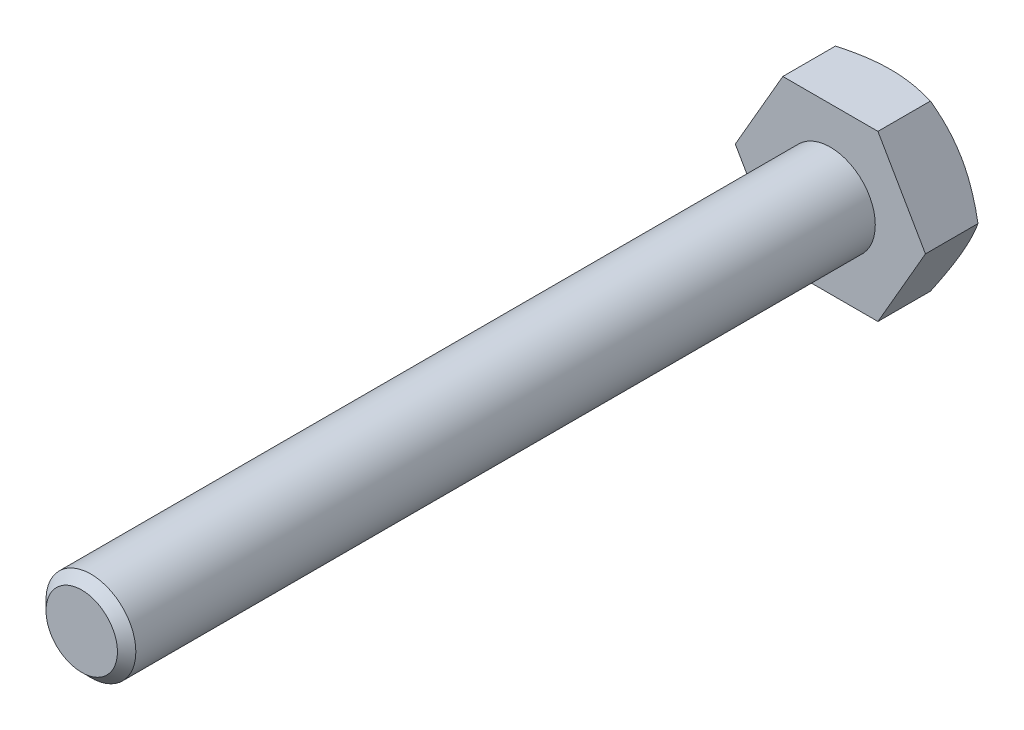
ISO-10303-21;
HEADER;
FILE_DESCRIPTION(('STEP AP214'),'2;1');
FILE_NAME('part.step','',(''),(''),'','','');
FILE_SCHEMA(('AUTOMOTIVE_DESIGN { 1 0 10303 214 1 1 1 1 }'));
ENDSEC;
DATA;
#1=APPLICATION_CONTEXT('core data for automotive mechanical design processes');
#2=APPLICATION_PROTOCOL_DEFINITION('international standard','automotive_design',2000,#1);
#3=PRODUCT_CONTEXT('',#1,'mechanical');
#4=PRODUCT('Part','Part','',(#3));
#5=PRODUCT_RELATED_PRODUCT_CATEGORY('part','',(#4));
#6=PRODUCT_DEFINITION_FORMATION('','',#4);
#7=PRODUCT_DEFINITION_CONTEXT('part definition',#1,'design');
#8=PRODUCT_DEFINITION('design','',#6,#7);
#9=PRODUCT_DEFINITION_SHAPE('','',#8);
#10=(LENGTH_UNIT() NAMED_UNIT(*) SI_UNIT(.MILLI.,.METRE.));
#11=(NAMED_UNIT(*) PLANE_ANGLE_UNIT() SI_UNIT($,.RADIAN.));
#12=(NAMED_UNIT(*) SI_UNIT($,.STERADIAN.) SOLID_ANGLE_UNIT());
#13=UNCERTAINTY_MEASURE_WITH_UNIT(LENGTH_MEASURE(1.E-05),#10,'distance_accuracy_value','');
#14=(GEOMETRIC_REPRESENTATION_CONTEXT(3) GLOBAL_UNCERTAINTY_ASSIGNED_CONTEXT((#13)) GLOBAL_UNIT_ASSIGNED_CONTEXT((#10,
#11,#12)) REPRESENTATION_CONTEXT('',''));
#15=CARTESIAN_POINT('',(0.,0.,0.));
#16=DIRECTION('',(0.,0.,1.));
#17=DIRECTION('',(1.,0.,0.));
#18=AXIS2_PLACEMENT_3D('',#15,#16,#17);
#19=CARTESIAN_POINT('',(1.58771324027147,-2.75,2.));
#20=DIRECTION('',(-0.866025403784439,0.5,0.));
#21=DIRECTION('',(-0.5,-0.866025403784439,0.));
#22=AXIS2_PLACEMENT_3D('',#19,#20,#21);
#23=PLANE('',#22);
#24=CARTESIAN_POINT('',(3.17554195059678,0.000200000000001707,0.245686763364756));
#25=CARTESIAN_POINT('',(3.10576962051743,-0.120649220659903,0.205387662249254));
#26=CARTESIAN_POINT('',(3.03539502097908,-0.24254160262263,0.168736902597655));
#27=CARTESIAN_POINT('',(2.89342717394439,-0.488437126727888,0.104762182969802));
#28=CARTESIAN_POINT('',(2.82183140359859,-0.612444638573851,0.0774608556745041));
#29=CARTESIAN_POINT('',(2.67952717191843,-0.858922797975938,0.0349617452941237));
#30=CARTESIAN_POINT('',(2.60884060771578,-0.981355518587411,0.0194811186224597));
#31=CARTESIAN_POINT('',(2.46713482015519,-1.22679714236891,0.000999397369939557));
#32=CARTESIAN_POINT('',(2.39611611197038,-1.3498051532329,-0.00201700053739912));
#33=CARTESIAN_POINT('',(2.26341005486545,-1.57965878661078,0.00425314542854933));
#34=CARTESIAN_POINT('',(2.20170285541369,-1.68653879125401,0.0120001542767048));
#35=CARTESIAN_POINT('',(2.07869048467395,-1.89960246733474,0.0365551810643593));
#36=CARTESIAN_POINT('',(2.01738573896434,-2.00578540164888,0.053371589650577));
#37=CARTESIAN_POINT('',(1.89411967378235,-2.21928848939318,0.0954119223459613));
#38=CARTESIAN_POINT('',(1.83217395817123,-2.32658161614285,0.120814080687232));
#39=CARTESIAN_POINT('',(1.70920651275308,-2.53956747928405,0.178467225839978));
#40=CARTESIAN_POINT('',(1.64818320715446,-2.64526294502665,0.210704663298978));
#41=CARTESIAN_POINT('',(1.58759777021763,-2.7502,0.245686763364763));
#42=B_SPLINE_CURVE_WITH_KNOTS('',3,(#24,#25,#26,#27,#28,#29,#30,#31,#32,#33,#34,#35,#36,#37,#38,
#39,#40,#41),.UNSPECIFIED.,.F.,.F.,(4,2,2,2,2,2,2,2,4),(0.,0.435912828725885,0.872873557116326,
1.29901931904671,1.72464171213572,2.09526089052937,2.46622354066374,2.84541551798557,
3.22386274754524),.UNSPECIFIED.);
#43=CARTESIAN_POINT('',(3.17542648054293,0.,0.245620093061856));
#44=VERTEX_POINT('',#43);
#45=CARTESIAN_POINT('',(2.38156986040721,-1.375,0.));
#46=VERTEX_POINT('',#45);
#47=EDGE_CURVE('E124',#44,#46,#42,.T.);
#48=ORIENTED_EDGE('',*,*,#47,.F.);
#49=DIRECTION('',(0.,0.,-1.));
#50=VECTOR('',#49,1.);
#51=CARTESIAN_POINT('',(3.17542648054294,0.,2.));
#52=LINE('',#51,#50);
#53=CARTESIAN_POINT('',(3.17542648054294,0.,2.));
#54=VERTEX_POINT('',#53);
#55=EDGE_CURVE('E128',#54,#44,#52,.T.);
#56=ORIENTED_EDGE('',*,*,#55,.F.);
#57=DIRECTION('',(0.5,0.866025403784438,0.));
#58=VECTOR('',#57,1.);
#59=CARTESIAN_POINT('',(1.58771324027147,-2.75,2.));
#60=LINE('',#59,#58);
#61=CARTESIAN_POINT('',(1.58771324027147,-2.75,2.));
#62=VERTEX_POINT('',#61);
#63=EDGE_CURVE('E242',#62,#54,#60,.T.);
#64=ORIENTED_EDGE('',*,*,#63,.F.);
#65=DIRECTION('',(0.,0.,-1.));
#66=VECTOR('',#65,1.);
#67=CARTESIAN_POINT('',(1.58771324027147,-2.75,2.));
#68=LINE('',#67,#66);
#69=CARTESIAN_POINT('',(1.58771324027145,-2.75,0.245620093061854));
#70=VERTEX_POINT('',#69);
#71=EDGE_CURVE('E218',#62,#70,#68,.T.);
#72=ORIENTED_EDGE('',*,*,#71,.T.);
#73=EDGE_CURVE('E181',#46,#70,#42,.T.);
#74=ORIENTED_EDGE('',*,*,#73,.F.);
#75=EDGE_LOOP('',(#48,#56,#64,#72,#74));
#76=FACE_BOUND('',#75,.T.);
#77=ADVANCED_FACE('F32',(#76),#23,.F.);
#78=CARTESIAN_POINT('',(3.17542648054294,0.,2.));
#79=DIRECTION('',(-0.866025403784438,-0.5,0.));
#80=DIRECTION('',(0.5,-0.866025403784438,0.));
#81=AXIS2_PLACEMENT_3D('',#78,#79,#80);
#82=PLANE('',#81);
#83=CARTESIAN_POINT('',(1.58759777021763,2.7502,0.245686763364752));
#84=CARTESIAN_POINT('',(1.65737010029698,2.6293507793401,0.205387662249252));
#85=CARTESIAN_POINT('',(1.72774469983533,2.50745839737737,0.168736902597655));
#86=CARTESIAN_POINT('',(1.86971254687002,2.26156287327211,0.104762182969804));
#87=CARTESIAN_POINT('',(1.94130831721583,2.13755536142615,0.0774608556745066));
#88=CARTESIAN_POINT('',(2.08361254889599,1.89107720202406,0.0349617452941277));
#89=CARTESIAN_POINT('',(2.15429911309864,1.76864448141259,0.0194811186224644));
#90=CARTESIAN_POINT('',(2.29600490065922,1.52320285763109,0.000999397369945049));
#91=CARTESIAN_POINT('',(2.36702360884403,1.40019484676709,-0.00201700053739336));
#92=CARTESIAN_POINT('',(2.49972966594897,1.17034121338921,0.00425314542855519));
#93=CARTESIAN_POINT('',(2.56143686540072,1.06346120874598,0.0120001542767105));
#94=CARTESIAN_POINT('',(2.68444923614046,0.850397532665255,0.0365551810643646));
#95=CARTESIAN_POINT('',(2.74575398185008,0.744214598351115,0.0533715896505821));
#96=CARTESIAN_POINT('',(2.86902004703206,0.530711510606819,0.0954119223459655));
#97=CARTESIAN_POINT('',(2.93096576264318,0.423418383857147,0.120814080687235));
#98=CARTESIAN_POINT('',(3.05393320806134,0.210432520715949,0.17846722583998));
#99=CARTESIAN_POINT('',(3.11495651365995,0.104737054973347,0.210704663298979));
#100=CARTESIAN_POINT('',(3.17554195059678,-0.000199999999999859,0.245686763364762));
#101=B_SPLINE_CURVE_WITH_KNOTS('',3,(#83,#84,#85,#86,#87,#88,#89,#90,#91,#92,#93,#94,#95,#96,
#97,#98,#99,#100),.UNSPECIFIED.,.F.,.F.,(4,2,2,2,2,2,2,2,4),(0.,0.435912828725885,
0.872873557116326,1.29901931904671,1.72464171213573,2.09526089052937,2.46622354066374,
2.84541551798557,3.22386274754524),.UNSPECIFIED.);
#102=CARTESIAN_POINT('',(1.58771324027148,2.74999999999998,0.245620093061853));
#103=VERTEX_POINT('',#102);
#104=CARTESIAN_POINT('',(2.38156986040721,1.375,0.));
#105=VERTEX_POINT('',#104);
#106=EDGE_CURVE('E103',#103,#105,#101,.T.);
#107=ORIENTED_EDGE('',*,*,#106,.F.);
#108=DIRECTION('',(0.,0.,-1.));
#109=VECTOR('',#108,1.);
#110=CARTESIAN_POINT('',(1.58771324027147,2.75,2.));
#111=LINE('',#110,#109);
#112=CARTESIAN_POINT('',(1.58771324027147,2.75,2.));
#113=VERTEX_POINT('',#112);
#114=EDGE_CURVE('E227',#113,#103,#111,.T.);
#115=ORIENTED_EDGE('',*,*,#114,.F.);
#116=DIRECTION('',(-0.5,0.866025403784438,0.));
#117=VECTOR('',#116,1.);
#118=CARTESIAN_POINT('',(3.17542648054294,0.,2.));
#119=LINE('',#118,#117);
#120=EDGE_CURVE('E246',#54,#113,#119,.T.);
#121=ORIENTED_EDGE('',*,*,#120,.F.);
#122=ORIENTED_EDGE('',*,*,#55,.T.);
#123=EDGE_CURVE('E116',#105,#44,#101,.T.);
#124=ORIENTED_EDGE('',*,*,#123,.F.);
#125=EDGE_LOOP('',(#107,#115,#121,#122,#124));
#126=FACE_BOUND('',#125,.T.);
#127=ADVANCED_FACE('F136',(#126),#82,.F.);
#128=CARTESIAN_POINT('',(1.58771324027147,2.75,2.));
#129=DIRECTION('',(0.,-1.,0.));
#130=DIRECTION('',(0.,0.,-1.));
#131=AXIS2_PLACEMENT_3D('',#128,#129,#130);
#132=PLANE('',#131);
#133=CARTESIAN_POINT('',(-4.31638594918232,2.75,1.36715210704405));
#134=CARTESIAN_POINT('',(-4.19581737051592,2.75,1.30845994096474));
#135=CARTESIAN_POINT('',(-4.07497746694739,2.75,1.25031586425216));
#136=CARTESIAN_POINT('',(-3.83261088383623,2.75,1.13543119741228));
#137=CARTESIAN_POINT('',(-3.71108410410335,2.75,1.07869081888196));
#138=CARTESIAN_POINT('',(-3.46659808789897,2.75,0.966646426591317));
#139=CARTESIAN_POINT('',(-3.34363468385964,2.75,0.911351476138761));
#140=CARTESIAN_POINT('',(-3.09674757673776,2.75,0.802956993957643));
#141=CARTESIAN_POINT('',(-2.972823917902,2.75,0.749857361778766));
#142=CARTESIAN_POINT('',(-2.71965806564943,2.75,0.644703117588246));
#143=CARTESIAN_POINT('',(-2.59037652858395,2.75,0.592742724367116));
#144=CARTESIAN_POINT('',(-2.33032018429188,2.75,0.492631038352346));
#145=CARTESIAN_POINT('',(-2.19954521421087,2.75,0.444480165603219));
#146=CARTESIAN_POINT('',(-1.9365223444922,2.75,0.353213656190183));
#147=CARTESIAN_POINT('',(-1.80427786301001,2.75,0.310088265151207));
#148=CARTESIAN_POINT('',(-1.53789259482414,2.75,0.230222209632179));
#149=CARTESIAN_POINT('',(-1.40375240288282,2.75,0.193479588678769));
#150=CARTESIAN_POINT('',(-1.13423793476322,2.75,0.128302067791659));
#151=CARTESIAN_POINT('',(-0.998874970875652,2.75,0.0998212369444805));
#152=CARTESIAN_POINT('',(-0.726413092453885,2.75,0.0527456161691723));
#153=CARTESIAN_POINT('',(-0.589314364619276,2.75,0.0341497721022308));
#154=CARTESIAN_POINT('',(-0.315877662564309,2.75,0.00856858652498791));
#155=CARTESIAN_POINT('',(-0.179554395289457,2.75,0.0014299267905237));
#156=CARTESIAN_POINT('',(0.0932131339370565,2.75,-0.00103867463557896));
#157=CARTESIAN_POINT('',(0.229657397936016,2.75,0.00363158744684535));
#158=CARTESIAN_POINT('',(0.459764674388275,2.75,0.0211304631968855));
#159=CARTESIAN_POINT('',(0.553667213671686,2.75,0.0310050171194729));
#160=CARTESIAN_POINT('',(0.740814471055632,2.75,0.055760139531657));
#161=CARTESIAN_POINT('',(0.834059104056982,2.75,0.0706413439292701));
#162=CARTESIAN_POINT('',(1.11266283109748,2.75,0.122015798898182));
#163=CARTESIAN_POINT('',(1.29679769159134,2.75,0.165231761163537));
#164=CARTESIAN_POINT('',(1.57226006867404,2.75,0.240559912331172));
#165=CARTESIAN_POINT('',(1.66500394654352,2.75,0.267790894506829));
#166=CARTESIAN_POINT('',(1.84959145582332,2.75,0.325176661417261));
#167=CARTESIAN_POINT('',(1.9414350804195,2.75,0.355331468264057));
#168=CARTESIAN_POINT('',(2.12425036464145,2.75,0.418073021824297));
#169=CARTESIAN_POINT('',(2.21522226940173,2.75,0.450659060772911));
#170=CARTESIAN_POINT('',(2.3964050130485,2.75,0.517870145035879));
#171=CARTESIAN_POINT('',(2.48661586829762,2.75,0.552495146383974));
#172=CARTESIAN_POINT('',(2.72631941369534,2.75,0.647111868128739));
#173=CARTESIAN_POINT('',(2.87521406734214,2.75,0.708617133437105));
#174=CARTESIAN_POINT('',(3.17149877963133,2.75,0.835163108096415));
#175=CARTESIAN_POINT('',(3.31888867900127,2.75,0.900204187184521));
#176=CARTESIAN_POINT('',(3.612498606976,2.75,1.0329937298421));
#177=CARTESIAN_POINT('',(3.7587182324204,2.75,1.10074308197789));
#178=CARTESIAN_POINT('',(4.05017738563283,2.75,1.23832197569377));
#179=CARTESIAN_POINT('',(4.1954168842448,2.75,1.3081515788239));
#180=CARTESIAN_POINT('',(4.63039070223179,2.75,1.52027220806308));
#181=CARTESIAN_POINT('',(4.91893915080495,2.75,1.66499194206909));
#182=CARTESIAN_POINT('',(5.49386340867002,2.75,1.95851426505822));
#183=CARTESIAN_POINT('',(5.78023963786972,2.75,2.1073160378755));
#184=CARTESIAN_POINT('',(6.32194576487132,2.75,2.39216757225533));
#185=CARTESIAN_POINT('',(6.57742037004848,2.75,2.52794261914921));
#186=CARTESIAN_POINT('',(7.08750371442345,2.75,2.80114245272759));
#187=CARTESIAN_POINT('',(7.34211240206399,2.75,2.93856733551162));
#188=CARTESIAN_POINT('',(7.84983547824256,2.75,3.21419429818602));
#189=CARTESIAN_POINT('',(8.10295203313654,2.75,3.35239239225699));
#190=CARTESIAN_POINT('',(8.60864374493556,2.75,3.62973059253265));
#191=CARTESIAN_POINT('',(8.86121894150219,2.75,3.76887062638957));
#192=CARTESIAN_POINT('',(9.11360311770114,2.75,3.90835389259637));
#193=B_SPLINE_CURVE_WITH_KNOTS('',3,(#133,#134,#135,#136,#137,#138,#139,#140,#141,#142,#143,
#144,#145,#146,#147,#148,#149,#150,#151,#152,#153,#154,#155,#156,#157,#158,#159,#160,#161,#162,
#163,#164,#165,#166,#167,#168,#169,#170,#171,#172,#173,#174,#175,#176,#177,#178,#179,#180,#181,
#182,#183,#184,#185,#186,#187,#188,#189,#190,#191,#192),.UNSPECIFIED.,.F.,.F.,(4,2,2,2,2,2,2,2,
2,2,2,2,2,2,2,2,2,2,2,2,2,2,2,2,2,2,2,2,2,4),(0.,0.402290608258888,0.80464149378454,
1.20909649725655,1.61353297371178,2.03148461048144,2.44948226730263,2.86665458560833,
3.28369880400756,3.69837799217314,4.1130129499138,4.52205162226931,4.93109735302036,
5.21422195546482,5.49738253190362,6.06398562819829,6.35393648052208,6.64388952582945,
6.93375848874895,7.22362120349515,7.70684704660544,8.19012351781079,8.67355987154431,
9.15701054332948,10.1253686031769,11.0935344400116,11.9614658313278,12.8294480255312,
13.6946049258819,14.5596961132789),.UNSPECIFIED.);
#194=CARTESIAN_POINT('',(-1.58771324027148,2.74999999999998,0.245620093061856));
#195=VERTEX_POINT('',#194);
#196=CARTESIAN_POINT('',(0.,2.75,0.));
#197=VERTEX_POINT('',#196);
#198=EDGE_CURVE('E47',#195,#197,#193,.T.);
#199=ORIENTED_EDGE('',*,*,#198,.F.);
#200=DIRECTION('',(0.,0.,-1.));
#201=VECTOR('',#200,1.);
#202=CARTESIAN_POINT('',(-1.58771324027147,2.75,2.));
#203=LINE('',#202,#201);
#204=CARTESIAN_POINT('',(-1.58771324027147,2.75,2.));
#205=VERTEX_POINT('',#204);
#206=EDGE_CURVE('E220',#205,#195,#203,.T.);
#207=ORIENTED_EDGE('',*,*,#206,.F.);
#208=DIRECTION('',(-1.,0.,0.));
#209=VECTOR('',#208,1.);
#210=CARTESIAN_POINT('',(1.58771324027147,2.75,2.));
#211=LINE('',#210,#209);
#212=EDGE_CURVE('E250',#113,#205,#211,.T.);
#213=ORIENTED_EDGE('',*,*,#212,.F.);
#214=ORIENTED_EDGE('',*,*,#114,.T.);
#215=EDGE_CURVE('E110',#197,#103,#193,.T.);
#216=ORIENTED_EDGE('',*,*,#215,.F.);
#217=EDGE_LOOP('',(#199,#207,#213,#214,#216));
#218=FACE_BOUND('',#217,.T.);
#219=ADVANCED_FACE('F191',(#218),#132,.F.);
#220=CARTESIAN_POINT('',(-1.58771324027147,2.75,2.));
#221=DIRECTION('',(0.866025403784439,-0.5,0.));
#222=DIRECTION('',(0.5,0.866025403784439,0.));
#223=AXIS2_PLACEMENT_3D('',#220,#221,#222);
#224=PLANE('',#223);
#225=CARTESIAN_POINT('',(-3.17554195059678,-0.000200000000001425,0.245686763364756));
#226=CARTESIAN_POINT('',(-3.10576962051743,0.120649220659901,0.205387662249244));
#227=CARTESIAN_POINT('',(-3.03539502097908,0.242541602622629,0.168736902597647));
#228=CARTESIAN_POINT('',(-2.89342717394439,0.488437126727888,0.104762182969802));
#229=CARTESIAN_POINT('',(-2.82183140359859,0.612444638573852,0.0774608556745108));
#230=CARTESIAN_POINT('',(-2.67952717191843,0.85892279797594,0.0349617452941296));
#231=CARTESIAN_POINT('',(-2.60884060771578,0.981355518587412,0.0194811186224586));
#232=CARTESIAN_POINT('',(-2.46713482015519,1.22679714236891,0.000999397369939867));
#233=CARTESIAN_POINT('',(-2.39611611197038,1.3498051532329,-0.00201700053739041));
#234=CARTESIAN_POINT('',(-2.26341005486545,1.57965878661079,0.00425314542855696));
#235=CARTESIAN_POINT('',(-2.20170285541369,1.68653879125402,0.0120001542767051));
#236=CARTESIAN_POINT('',(-2.07869048467395,1.89960246733474,0.0365551810643579));
#237=CARTESIAN_POINT('',(-2.01738573896434,2.00578540164888,0.0533715896505813));
#238=CARTESIAN_POINT('',(-1.89411967378235,2.21928848939318,0.0954119223459695));
#239=CARTESIAN_POINT('',(-1.83217395817123,2.32658161614285,0.120814080687238));
#240=CARTESIAN_POINT('',(-1.70920651275308,2.53956747928405,0.17846722583998));
#241=CARTESIAN_POINT('',(-1.64818320715446,2.64526294502665,0.210704663298978));
#242=CARTESIAN_POINT('',(-1.58759777021763,2.7502,0.245686763364763));
#243=B_SPLINE_CURVE_WITH_KNOTS('',3,(#225,#226,#227,#228,#229,#230,#231,#232,#233,#234,#235,
#236,#237,#238,#239,#240,#241,#242),.UNSPECIFIED.,.F.,.F.,(4,2,2,2,2,2,2,2,4),(0.,
0.435912828725885,0.872873557116327,1.29901931904671,1.72464171213573,2.09526089052937,
2.46622354066374,2.84541551798557,3.22386274754524),.UNSPECIFIED.);
#244=CARTESIAN_POINT('',(-3.17542648054293,0.,0.245620093061855));
#245=VERTEX_POINT('',#244);
#246=CARTESIAN_POINT('',(-2.38156986040721,1.375,0.));
#247=VERTEX_POINT('',#246);
#248=EDGE_CURVE('E55',#245,#247,#243,.T.);
#249=ORIENTED_EDGE('',*,*,#248,.F.);
#250=DIRECTION('',(0.,0.,-1.));
#251=VECTOR('',#250,1.);
#252=CARTESIAN_POINT('',(-3.17542648054294,0.,2.));
#253=LINE('',#252,#251);
#254=CARTESIAN_POINT('',(-3.17542648054294,0.,2.));
#255=VERTEX_POINT('',#254);
#256=EDGE_CURVE('E217',#255,#245,#253,.T.);
#257=ORIENTED_EDGE('',*,*,#256,.F.);
#258=DIRECTION('',(-0.5,-0.866025403784438,0.));
#259=VECTOR('',#258,1.);
#260=CARTESIAN_POINT('',(-1.58771324027147,2.75,2.));
#261=LINE('',#260,#259);
#262=EDGE_CURVE('E252',#205,#255,#261,.T.);
#263=ORIENTED_EDGE('',*,*,#262,.F.);
#264=ORIENTED_EDGE('',*,*,#206,.T.);
#265=EDGE_CURVE('E115',#247,#195,#243,.T.);
#266=ORIENTED_EDGE('',*,*,#265,.F.);
#267=EDGE_LOOP('',(#249,#257,#263,#264,#266));
#268=FACE_BOUND('',#267,.T.);
#269=ADVANCED_FACE('F236',(#268),#224,.F.);
#270=CARTESIAN_POINT('',(-3.17542648054294,0.,2.));
#271=DIRECTION('',(0.866025403784438,0.5,0.));
#272=DIRECTION('',(-0.5,0.866025403784438,0.));
#273=AXIS2_PLACEMENT_3D('',#270,#271,#272);
#274=PLANE('',#273);
#275=CARTESIAN_POINT('',(-1.58759777021763,-2.7502,0.245686763364752));
#276=CARTESIAN_POINT('',(-1.65737010029698,-2.6293507793401,0.205387662249251));
#277=CARTESIAN_POINT('',(-1.72774469983533,-2.50745839737737,0.168736902597654));
#278=CARTESIAN_POINT('',(-1.86971254687003,-2.26156287327211,0.104762182969803));
#279=CARTESIAN_POINT('',(-1.94130831721583,-2.13755536142615,0.0774608556745064));
#280=CARTESIAN_POINT('',(-2.08361254889599,-1.89107720202406,0.0349617452941278));
#281=CARTESIAN_POINT('',(-2.15429911309864,-1.76864448141259,0.0194811186224644));
#282=CARTESIAN_POINT('',(-2.29600490065922,-1.52320285763109,0.000999397369945159));
#283=CARTESIAN_POINT('',(-2.36702360884403,-1.40019484676709,-0.00201700053739319));
#284=CARTESIAN_POINT('',(-2.49972966594897,-1.17034121338921,0.00425314542855519));
#285=CARTESIAN_POINT('',(-2.56143686540072,-1.06346120874598,0.0120001542767104));
#286=CARTESIAN_POINT('',(-2.68444923614046,-0.850397532665254,0.0365551810643644));
#287=CARTESIAN_POINT('',(-2.74575398185008,-0.744214598351115,0.053371589650582));
#288=CARTESIAN_POINT('',(-2.86902004703206,-0.530711510606819,0.0954119223459656));
#289=CARTESIAN_POINT('',(-2.93096576264318,-0.423418383857146,0.120814080687235));
#290=CARTESIAN_POINT('',(-3.05393320806134,-0.210432520715948,0.17846722583998));
#291=CARTESIAN_POINT('',(-3.11495651365995,-0.104737054973347,0.210704663298979));
#292=CARTESIAN_POINT('',(-3.17554195059678,0.000200000000000259,0.245686763364762));
#293=B_SPLINE_CURVE_WITH_KNOTS('',3,(#275,#276,#277,#278,#279,#280,#281,#282,#283,#284,#285,
#286,#287,#288,#289,#290,#291,#292),.UNSPECIFIED.,.F.,.F.,(4,2,2,2,2,2,2,2,4),(0.,
0.435912828725885,0.872873557116326,1.29901931904671,1.72464171213573,2.09526089052937,
2.46622354066374,2.84541551798557,3.22386274754524),.UNSPECIFIED.);
#294=CARTESIAN_POINT('',(-1.58771324027162,-2.75,0.245620093061744));
#295=VERTEX_POINT('',#294);
#296=CARTESIAN_POINT('',(-2.38156986040721,-1.375,0.));
#297=VERTEX_POINT('',#296);
#298=EDGE_CURVE('E175',#295,#297,#293,.T.);
#299=ORIENTED_EDGE('',*,*,#298,.F.);
#300=DIRECTION('',(0.,0.,-1.));
#301=VECTOR('',#300,1.);
#302=CARTESIAN_POINT('',(-1.58771324027147,-2.75,2.));
#303=LINE('',#302,#301);
#304=CARTESIAN_POINT('',(-1.58771324027147,-2.75,2.));
#305=VERTEX_POINT('',#304);
#306=EDGE_CURVE('E211',#305,#295,#303,.T.);
#307=ORIENTED_EDGE('',*,*,#306,.F.);
#308=DIRECTION('',(0.5,-0.866025403784438,0.));
#309=VECTOR('',#308,1.);
#310=CARTESIAN_POINT('',(-3.17542648054294,0.,2.));
#311=LINE('',#310,#309);
#312=EDGE_CURVE('E254',#255,#305,#311,.T.);
#313=ORIENTED_EDGE('',*,*,#312,.F.);
#314=ORIENTED_EDGE('',*,*,#256,.T.);
#315=EDGE_CURVE('E138',#297,#245,#293,.T.);
#316=ORIENTED_EDGE('',*,*,#315,.F.);
#317=EDGE_LOOP('',(#299,#307,#313,#314,#316));
#318=FACE_BOUND('',#317,.T.);
#319=ADVANCED_FACE('F209',(#318),#274,.F.);
#320=CARTESIAN_POINT('',(-1.58771324027147,-2.75,2.));
#321=DIRECTION('',(0.,1.,0.));
#322=DIRECTION('',(-1.,0.,0.));
#323=AXIS2_PLACEMENT_3D('',#320,#321,#322);
#324=PLANE('',#323);
#325=CARTESIAN_POINT('',(-4.31638594918231,-2.75,1.36715210704405));
#326=CARTESIAN_POINT('',(-4.19581737051592,-2.75,1.30845994096474));
#327=CARTESIAN_POINT('',(-4.07497746694739,-2.75,1.25031586425216));
#328=CARTESIAN_POINT('',(-3.83261088383623,-2.75,1.13543119741228));
#329=CARTESIAN_POINT('',(-3.71108410410335,-2.75,1.07869081888196));
#330=CARTESIAN_POINT('',(-3.46659808789897,-2.75,0.966646426591317));
#331=CARTESIAN_POINT('',(-3.34363468385964,-2.75,0.911351476138761));
#332=CARTESIAN_POINT('',(-3.09674757673776,-2.75,0.802956993957643));
#333=CARTESIAN_POINT('',(-2.972823917902,-2.75,0.749857361778766));
#334=CARTESIAN_POINT('',(-2.71965806564943,-2.75,0.644703117588245));
#335=CARTESIAN_POINT('',(-2.59037652858395,-2.75,0.592742724367116));
#336=CARTESIAN_POINT('',(-2.33032018429188,-2.75,0.492631038352346));
#337=CARTESIAN_POINT('',(-2.19954521421087,-2.75,0.444480165603219));
#338=CARTESIAN_POINT('',(-1.9365223444922,-2.75,0.353213656190183));
#339=CARTESIAN_POINT('',(-1.80427786301001,-2.75,0.310088265151207));
#340=CARTESIAN_POINT('',(-1.53789259482414,-2.75,0.230222209632179));
#341=CARTESIAN_POINT('',(-1.40375240288282,-2.75,0.193479588678769));
#342=CARTESIAN_POINT('',(-1.13423793476322,-2.75,0.128302067791659));
#343=CARTESIAN_POINT('',(-0.998874970875651,-2.75,0.0998212369444806));
#344=CARTESIAN_POINT('',(-0.726413092453884,-2.75,0.0527456161691724));
#345=CARTESIAN_POINT('',(-0.589314364619276,-2.75,0.0341497721022307));
#346=CARTESIAN_POINT('',(-0.315877662564308,-2.75,0.00856858652498762));
#347=CARTESIAN_POINT('',(-0.179554395289456,-2.75,0.00142992679052341));
#348=CARTESIAN_POINT('',(0.0932131339370574,-2.75,-0.00103867463557906));
#349=CARTESIAN_POINT('',(0.229657397936017,-2.75,0.00363158744684545));
#350=CARTESIAN_POINT('',(0.459764674388276,-2.75,0.0211304631968855));
#351=CARTESIAN_POINT('',(0.553667213671687,-2.75,0.0310050171194728));
#352=CARTESIAN_POINT('',(0.740814471055633,-2.75,0.0557601395316572));
#353=CARTESIAN_POINT('',(0.834059104056983,-2.75,0.0706413439292707));
#354=CARTESIAN_POINT('',(1.11266283109748,-2.75,0.122015798898182));
#355=CARTESIAN_POINT('',(1.29679769159134,-2.75,0.165231761163532));
#356=CARTESIAN_POINT('',(1.57226006867404,-2.75,0.240559912331175));
#357=CARTESIAN_POINT('',(1.66500394654352,-2.75,0.267790894506837));
#358=CARTESIAN_POINT('',(1.84959145582332,-2.75,0.325176661417269));
#359=CARTESIAN_POINT('',(1.9414350804195,-2.75,0.35533146826406));
#360=CARTESIAN_POINT('',(2.12425036464146,-2.75,0.418073021824296));
#361=CARTESIAN_POINT('',(2.21522226940173,-2.75,0.450659060772911));
#362=CARTESIAN_POINT('',(2.3964050130485,-2.75,0.51787014503588));
#363=CARTESIAN_POINT('',(2.48661586829762,-2.75,0.552495146383975));
#364=CARTESIAN_POINT('',(2.72631941369534,-2.75,0.64711186812874));
#365=CARTESIAN_POINT('',(2.87521406734214,-2.75,0.708617133437106));
#366=CARTESIAN_POINT('',(3.17149877963133,-2.75,0.835163108096417));
#367=CARTESIAN_POINT('',(3.31888867900127,-2.75,0.900204187184522));
#368=CARTESIAN_POINT('',(3.612498606976,-2.75,1.0329937298421));
#369=CARTESIAN_POINT('',(3.7587182324204,-2.75,1.10074308197789));
#370=CARTESIAN_POINT('',(4.05017738563283,-2.75,1.23832197569377));
#371=CARTESIAN_POINT('',(4.19541688424481,-2.75,1.3081515788239));
#372=CARTESIAN_POINT('',(4.63039070223179,-2.75,1.52027220806308));
#373=CARTESIAN_POINT('',(4.91893915080495,-2.75,1.6649919420691));
#374=CARTESIAN_POINT('',(5.49386340867001,-2.75,1.95851426505822));
#375=CARTESIAN_POINT('',(5.78023963786972,-2.75,2.1073160378755));
#376=CARTESIAN_POINT('',(6.32194576487132,-2.75,2.39216757225532));
#377=CARTESIAN_POINT('',(6.57742037004848,-2.75,2.5279426191492));
#378=CARTESIAN_POINT('',(7.08750371442345,-2.75,2.80114245272759));
#379=CARTESIAN_POINT('',(7.34211240206399,-2.75,2.93856733551163));
#380=CARTESIAN_POINT('',(7.84983547824256,-2.75,3.21419429818602));
#381=CARTESIAN_POINT('',(8.10295203313654,-2.75,3.35239239225698));
#382=CARTESIAN_POINT('',(8.60864374493556,-2.75,3.62973059253264));
#383=CARTESIAN_POINT('',(8.8612189415022,-2.75,3.76887062638956));
#384=CARTESIAN_POINT('',(9.11360311770115,-2.75,3.90835389259637));
#385=B_SPLINE_CURVE_WITH_KNOTS('',3,(#325,#326,#327,#328,#329,#330,#331,#332,#333,#334,#335,
#336,#337,#338,#339,#340,#341,#342,#343,#344,#345,#346,#347,#348,#349,#350,#351,#352,#353,#354,
#355,#356,#357,#358,#359,#360,#361,#362,#363,#364,#365,#366,#367,#368,#369,#370,#371,#372,#373,
#374,#375,#376,#377,#378,#379,#380,#381,#382,#383,#384),.UNSPECIFIED.,.F.,.F.,(4,2,2,2,2,2,2,2,
2,2,2,2,2,2,2,2,2,2,2,2,2,2,2,2,2,2,2,2,2,4),(0.,0.402290608258888,0.80464149378454,
1.20909649725655,1.61353297371178,2.03148461048144,2.44948226730263,2.86665458560833,
3.28369880400756,3.69837799217314,4.1130129499138,4.52205162226931,4.93109735302036,
5.21422195546482,5.49738253190362,6.06398562819829,6.35393648052208,6.64388952582945,
6.93375848874895,7.22362120349515,7.70684704660544,8.19012351781079,8.67355987154431,
9.15701054332948,10.1253686031769,11.0935344400116,11.9614658313277,12.8294480255312,
13.6946049258819,14.5596961132789),.UNSPECIFIED.);
#386=CARTESIAN_POINT('',(0.,-2.75,0.));
#387=VERTEX_POINT('',#386);
#388=EDGE_CURVE('E195',#70,#387,#385,.F.);
#389=ORIENTED_EDGE('',*,*,#388,.F.);
#390=ORIENTED_EDGE('',*,*,#71,.F.);
#391=DIRECTION('',(1.,0.,0.));
#392=VECTOR('',#391,1.);
#393=CARTESIAN_POINT('',(-1.58771324027147,-2.75,2.));
#394=LINE('',#393,#392);
#395=EDGE_CURVE('E216',#305,#62,#394,.T.);
#396=ORIENTED_EDGE('',*,*,#395,.F.);
#397=ORIENTED_EDGE('',*,*,#306,.T.);
#398=EDGE_CURVE('E133',#387,#295,#385,.F.);
#399=ORIENTED_EDGE('',*,*,#398,.F.);
#400=EDGE_LOOP('',(#389,#390,#396,#397,#399));
#401=FACE_BOUND('',#400,.T.);
#402=ADVANCED_FACE('F214',(#401),#324,.F.);
#403=CARTESIAN_POINT('',(3.17542648054294,0.,2.));
#404=DIRECTION('',(0.,0.,1.));
#405=DIRECTION('',(1.,0.,0.));
#406=AXIS2_PLACEMENT_3D('',#403,#404,#405);
#407=PLANE('',#406);
#408=ORIENTED_EDGE('',*,*,#63,.T.);
#409=ORIENTED_EDGE('',*,*,#120,.T.);
#410=ORIENTED_EDGE('',*,*,#212,.T.);
#411=ORIENTED_EDGE('',*,*,#262,.T.);
#412=ORIENTED_EDGE('',*,*,#312,.T.);
#413=ORIENTED_EDGE('',*,*,#395,.T.);
#414=EDGE_LOOP('',(#408,#409,#410,#411,#412,#413));
#415=FACE_BOUND('',#414,.T.);
#416=CARTESIAN_POINT('',(0.,0.,2.));
#417=DIRECTION('',(0.,0.,1.));
#418=DIRECTION('',(1.,0.,0.));
#419=AXIS2_PLACEMENT_3D('',#416,#417,#418);
#420=CIRCLE('',#419,1.5);
#421=CARTESIAN_POINT('',(1.5,0.,2.));
#422=VERTEX_POINT('',#421);
#423=EDGE_CURVE('E240',#422,#422,#420,.T.);
#424=ORIENTED_EDGE('',*,*,#423,.F.);
#425=EDGE_LOOP('',(#424));
#426=FACE_BOUND('',#425,.T.);
#427=ADVANCED_FACE('F256',(#415,#426),#407,.T.);
#428=CARTESIAN_POINT('',(0.,0.,27.));
#429=DIRECTION('',(0.,0.,-1.));
#430=DIRECTION('',(-1.,0.,0.));
#431=AXIS2_PLACEMENT_3D('',#428,#429,#430);
#432=CYLINDRICAL_SURFACE('',#431,1.5);
#433=CARTESIAN_POINT('',(0.,0.,26.693));
#434=DIRECTION('',(0.,0.,1.));
#435=DIRECTION('',(1.,0.,0.));
#436=AXIS2_PLACEMENT_3D('',#433,#434,#435);
#437=CIRCLE('',#436,1.5);
#438=CARTESIAN_POINT('',(1.5,0.,26.693));
#439=VERTEX_POINT('',#438);
#440=EDGE_CURVE('E11',#439,#439,#437,.F.);
#441=ORIENTED_EDGE('',*,*,#440,.T.);
#442=EDGE_LOOP('',(#441));
#443=FACE_BOUND('',#442,.T.);
#444=ORIENTED_EDGE('',*,*,#423,.T.);
#445=EDGE_LOOP('',(#444));
#446=FACE_BOUND('',#445,.T.);
#447=ADVANCED_FACE('F274',(#443,#446),#432,.T.);
#448=CARTESIAN_POINT('',(0.,0.,27.));
#449=DIRECTION('',(0.,0.,1.));
#450=DIRECTION('',(1.,0.,0.));
#451=AXIS2_PLACEMENT_3D('',#448,#449,#450);
#452=PLANE('',#451);
#453=CARTESIAN_POINT('',(0.,0.,27.));
#454=DIRECTION('',(0.,0.,1.));
#455=DIRECTION('',(1.,0.,0.));
#456=AXIS2_PLACEMENT_3D('',#453,#454,#455);
#457=CIRCLE('',#456,1.193);
#458=CARTESIAN_POINT('',(1.193,0.,27.));
#459=VERTEX_POINT('',#458);
#460=EDGE_CURVE('E40',#459,#459,#457,.T.);
#461=ORIENTED_EDGE('',*,*,#460,.T.);
#462=EDGE_LOOP('',(#461));
#463=FACE_BOUND('',#462,.T.);
#464=ADVANCED_FACE('F163',(#463),#452,.T.);
#465=CARTESIAN_POINT('',(0.,0.,57.7350269189618));
#466=DIRECTION('',(0.,0.,1.));
#467=DIRECTION('',(1.,0.,0.));
#468=AXIS2_PLACEMENT_3D('',#465,#466,#467);
#469=CONICAL_SURFACE('',#468,102.75,1.0471975511966);
#470=ORIENTED_EDGE('',*,*,#123,.T.);
#471=ORIENTED_EDGE('',*,*,#47,.T.);
#472=CARTESIAN_POINT('',(0.,0.,0.));
#473=DIRECTION('',(0.,0.,1.));
#474=DIRECTION('',(1.,0.,0.));
#475=AXIS2_PLACEMENT_3D('',#472,#473,#474);
#476=CIRCLE('',#475,2.74999999999999);
#477=EDGE_CURVE('E121',#46,#105,#476,.T.);
#478=ORIENTED_EDGE('',*,*,#477,.T.);
#479=EDGE_LOOP('',(#470,#471,#478));
#480=FACE_BOUND('',#479,.T.);
#481=ADVANCED_FACE('F122',(#480),#469,.T.);
#482=ORIENTED_EDGE('',*,*,#73,.T.);
#483=ORIENTED_EDGE('',*,*,#388,.T.);
#484=EDGE_CURVE('E127',#387,#46,#476,.T.);
#485=ORIENTED_EDGE('',*,*,#484,.T.);
#486=EDGE_LOOP('',(#482,#483,#485));
#487=FACE_BOUND('',#486,.T.);
#488=ADVANCED_FACE('F233',(#487),#469,.T.);
#489=ORIENTED_EDGE('',*,*,#298,.T.);
#490=EDGE_CURVE('E204',#297,#387,#476,.T.);
#491=ORIENTED_EDGE('',*,*,#490,.T.);
#492=ORIENTED_EDGE('',*,*,#398,.T.);
#493=EDGE_LOOP('',(#489,#491,#492));
#494=FACE_BOUND('',#493,.T.);
#495=ADVANCED_FACE('F162',(#494),#469,.T.);
#496=ORIENTED_EDGE('',*,*,#248,.T.);
#497=EDGE_CURVE('E232',#247,#297,#476,.T.);
#498=ORIENTED_EDGE('',*,*,#497,.T.);
#499=ORIENTED_EDGE('',*,*,#315,.T.);
#500=EDGE_LOOP('',(#496,#498,#499));
#501=FACE_BOUND('',#500,.T.);
#502=ADVANCED_FACE('F161',(#501),#469,.T.);
#503=ORIENTED_EDGE('',*,*,#198,.T.);
#504=EDGE_CURVE('E130',#197,#247,#476,.T.);
#505=ORIENTED_EDGE('',*,*,#504,.T.);
#506=ORIENTED_EDGE('',*,*,#265,.T.);
#507=EDGE_LOOP('',(#503,#505,#506));
#508=FACE_BOUND('',#507,.T.);
#509=ADVANCED_FACE('F157',(#508),#469,.T.);
#510=ORIENTED_EDGE('',*,*,#215,.T.);
#511=ORIENTED_EDGE('',*,*,#106,.T.);
#512=CARTESIAN_POINT('',(0.,0.,0.));
#513=DIRECTION('',(0.,0.,1.));
#514=DIRECTION('',(1.,0.,0.));
#515=AXIS2_PLACEMENT_3D('',#512,#513,#514);
#516=CIRCLE('',#515,2.75);
#517=EDGE_CURVE('E107',#105,#197,#516,.T.);
#518=ORIENTED_EDGE('',*,*,#517,.T.);
#519=EDGE_LOOP('',(#510,#511,#518));
#520=FACE_BOUND('',#519,.T.);
#521=ADVANCED_FACE('F105',(#520),#469,.T.);
#522=CARTESIAN_POINT('',(3.17542648054294,0.,0.));
#523=DIRECTION('',(0.,0.,1.));
#524=DIRECTION('',(1.,0.,0.));
#525=AXIS2_PLACEMENT_3D('',#522,#523,#524);
#526=PLANE('',#525);
#527=ORIENTED_EDGE('',*,*,#517,.F.);
#528=ORIENTED_EDGE('',*,*,#477,.F.);
#529=ORIENTED_EDGE('',*,*,#484,.F.);
#530=ORIENTED_EDGE('',*,*,#490,.F.);
#531=ORIENTED_EDGE('',*,*,#497,.F.);
#532=ORIENTED_EDGE('',*,*,#504,.F.);
#533=EDGE_LOOP('',(#527,#528,#529,#530,#531,#532));
#534=FACE_BOUND('',#533,.T.);
#535=ADVANCED_FACE('F131',(#534),#526,.F.);
#536=CARTESIAN_POINT('',(0.,0.,27.));
#537=DIRECTION('',(0.,0.,-1.));
#538=DIRECTION('',(-1.,0.,0.));
#539=AXIS2_PLACEMENT_3D('',#536,#537,#538);
#540=CONICAL_SURFACE('',#539,1.193,0.785398163397441);
#541=ORIENTED_EDGE('',*,*,#440,.F.);
#542=EDGE_LOOP('',(#541));
#543=FACE_BOUND('',#542,.T.);
#544=ORIENTED_EDGE('',*,*,#460,.F.);
#545=EDGE_LOOP('',(#544));
#546=FACE_BOUND('',#545,.T.);
#547=ADVANCED_FACE('F34',(#543,#546),#540,.T.);
#548=CLOSED_SHELL('',(#77,#127,#219,#269,#319,#402,#427,#447,#464,#481,#488,#495,#502,#509,#521,
#535,#547));
#549=MANIFOLD_SOLID_BREP('B2',#548);
#550=ADVANCED_BREP_SHAPE_REPRESENTATION('',(#18,#549),#14);
#551=SHAPE_DEFINITION_REPRESENTATION(#9,#550);
ENDSEC;
END-ISO-10303-21;
